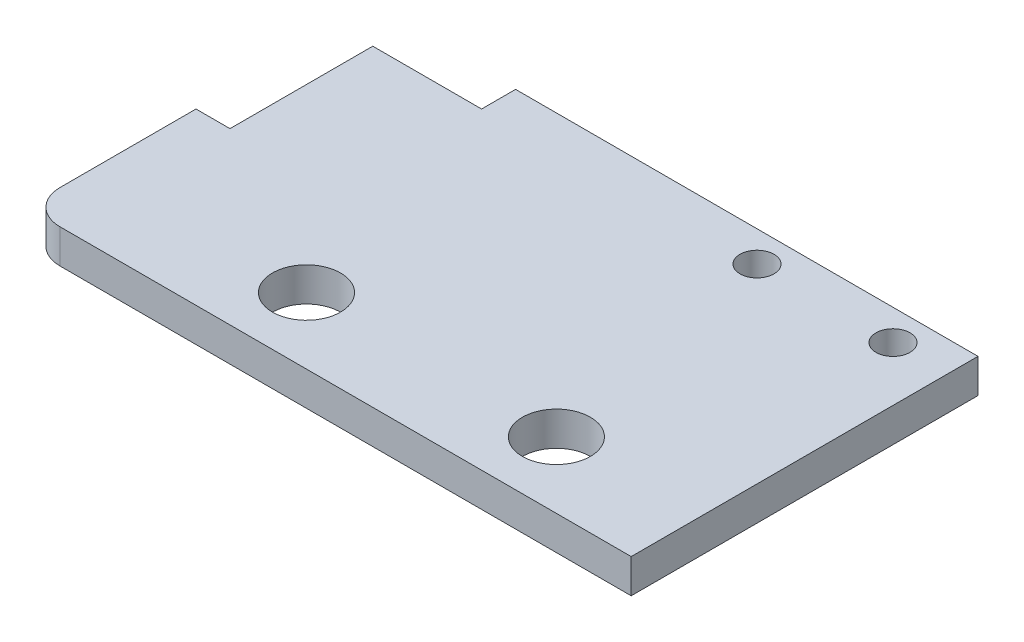
ISO-10303-21;
HEADER;
FILE_DESCRIPTION(('STEP AP214'),'2;1');
FILE_NAME('part.step','',(''),(''),'','','');
FILE_SCHEMA(('AUTOMOTIVE_DESIGN { 1 0 10303 214 1 1 1 1 }'));
ENDSEC;
DATA;
#1=APPLICATION_CONTEXT('core data for automotive mechanical design processes');
#2=APPLICATION_PROTOCOL_DEFINITION('international standard','automotive_design',2000,#1);
#3=PRODUCT_CONTEXT('',#1,'mechanical');
#4=PRODUCT('Part','Part','',(#3));
#5=PRODUCT_RELATED_PRODUCT_CATEGORY('part','',(#4));
#6=PRODUCT_DEFINITION_FORMATION('','',#4);
#7=PRODUCT_DEFINITION_CONTEXT('part definition',#1,'design');
#8=PRODUCT_DEFINITION('design','',#6,#7);
#9=PRODUCT_DEFINITION_SHAPE('','',#8);
#10=(LENGTH_UNIT() NAMED_UNIT(*) SI_UNIT(.MILLI.,.METRE.));
#11=(NAMED_UNIT(*) PLANE_ANGLE_UNIT() SI_UNIT($,.RADIAN.));
#12=(NAMED_UNIT(*) SI_UNIT($,.STERADIAN.) SOLID_ANGLE_UNIT());
#13=UNCERTAINTY_MEASURE_WITH_UNIT(LENGTH_MEASURE(1.E-05),#10,'distance_accuracy_value','');
#14=(GEOMETRIC_REPRESENTATION_CONTEXT(3) GLOBAL_UNCERTAINTY_ASSIGNED_CONTEXT((#13)) GLOBAL_UNIT_ASSIGNED_CONTEXT((#10,
#11,#12)) REPRESENTATION_CONTEXT('',''));
#15=CARTESIAN_POINT('',(0.,0.,0.));
#16=DIRECTION('',(0.,0.,1.));
#17=DIRECTION('',(1.,0.,0.));
#18=AXIS2_PLACEMENT_3D('',#15,#16,#17);
#19=CARTESIAN_POINT('',(3.2,1.,-9.2));
#20=DIRECTION('',(0.,0.,1.));
#21=DIRECTION('',(1.,0.,0.));
#22=AXIS2_PLACEMENT_3D('',#19,#20,#21);
#23=PLANE('',#22);
#24=DIRECTION('',(-1.,0.,0.));
#25=VECTOR('',#24,1.);
#26=CARTESIAN_POINT('',(3.2,0.,-9.2));
#27=LINE('',#26,#25);
#28=CARTESIAN_POINT('',(4.2,0.,-9.2));
#29=VERTEX_POINT('',#28);
#30=CARTESIAN_POINT('',(1.,0.,-9.2));
#31=VERTEX_POINT('',#30);
#32=EDGE_CURVE('E47',#29,#31,#27,.T.);
#33=ORIENTED_EDGE('',*,*,#32,.T.);
#34=DIRECTION('',(0.,-1.,0.));
#35=VECTOR('',#34,1.);
#36=CARTESIAN_POINT('',(1.,1.,-9.2));
#37=LINE('',#36,#35);
#38=CARTESIAN_POINT('',(1.,1.,-9.2));
#39=VERTEX_POINT('',#38);
#40=EDGE_CURVE('E108',#39,#31,#37,.T.);
#41=ORIENTED_EDGE('',*,*,#40,.F.);
#42=DIRECTION('',(-1.,0.,0.));
#43=VECTOR('',#42,1.);
#44=CARTESIAN_POINT('',(3.2,1.,-9.2));
#45=LINE('',#44,#43);
#46=CARTESIAN_POINT('',(4.2,1.,-9.2));
#47=VERTEX_POINT('',#46);
#48=EDGE_CURVE('E105',#47,#39,#45,.T.);
#49=ORIENTED_EDGE('',*,*,#48,.F.);
#50=DIRECTION('',(0.,1.,0.));
#51=VECTOR('',#50,1.);
#52=CARTESIAN_POINT('',(4.2,-9.,-9.2));
#53=LINE('',#52,#51);
#54=EDGE_CURVE('E107',#29,#47,#53,.T.);
#55=ORIENTED_EDGE('',*,*,#54,.F.);
#56=EDGE_LOOP('',(#33,#41,#49,#55));
#57=FACE_BOUND('',#56,.T.);
#58=ADVANCED_FACE('F32',(#57),#23,.F.);
#59=CARTESIAN_POINT('',(1.,1.,-5.));
#60=DIRECTION('',(-1.,0.,0.));
#61=DIRECTION('',(0.,0.,1.));
#62=AXIS2_PLACEMENT_3D('',#59,#60,#61);
#63=PLANE('',#62);
#64=DIRECTION('',(0.,0.,-1.));
#65=VECTOR('',#64,1.);
#66=CARTESIAN_POINT('',(1.,0.,-5.));
#67=LINE('',#66,#65);
#68=CARTESIAN_POINT('',(1.,0.,-5.));
#69=VERTEX_POINT('',#68);
#70=EDGE_CURVE('E166',#69,#31,#67,.T.);
#71=ORIENTED_EDGE('',*,*,#70,.F.);
#72=DIRECTION('',(0.,-1.,0.));
#73=VECTOR('',#72,1.);
#74=CARTESIAN_POINT('',(1.,1.,-5.));
#75=LINE('',#74,#73);
#76=CARTESIAN_POINT('',(1.,1.,-5.));
#77=VERTEX_POINT('',#76);
#78=EDGE_CURVE('E187',#77,#69,#75,.T.);
#79=ORIENTED_EDGE('',*,*,#78,.F.);
#80=DIRECTION('',(0.,0.,-1.));
#81=VECTOR('',#80,1.);
#82=CARTESIAN_POINT('',(1.,1.,-5.));
#83=LINE('',#82,#81);
#84=EDGE_CURVE('E113',#77,#39,#83,.T.);
#85=ORIENTED_EDGE('',*,*,#84,.T.);
#86=ORIENTED_EDGE('',*,*,#40,.T.);
#87=EDGE_LOOP('',(#71,#79,#85,#86));
#88=FACE_BOUND('',#87,.T.);
#89=ADVANCED_FACE('F215',(#88),#63,.T.);
#90=CARTESIAN_POINT('',(0.,1.,-5.));
#91=DIRECTION('',(0.,0.,-1.));
#92=DIRECTION('',(-1.,0.,0.));
#93=AXIS2_PLACEMENT_3D('',#90,#91,#92);
#94=PLANE('',#93);
#95=DIRECTION('',(1.,0.,0.));
#96=VECTOR('',#95,1.);
#97=CARTESIAN_POINT('',(0.,0.,-5.));
#98=LINE('',#97,#96);
#99=CARTESIAN_POINT('',(0.,0.,-5.));
#100=VERTEX_POINT('',#99);
#101=EDGE_CURVE('E168',#100,#69,#98,.T.);
#102=ORIENTED_EDGE('',*,*,#101,.F.);
#103=DIRECTION('',(0.,-1.,0.));
#104=VECTOR('',#103,1.);
#105=CARTESIAN_POINT('',(0.,1.,-5.));
#106=LINE('',#105,#104);
#107=CARTESIAN_POINT('',(0.,1.,-5.));
#108=VERTEX_POINT('',#107);
#109=EDGE_CURVE('E184',#108,#100,#106,.T.);
#110=ORIENTED_EDGE('',*,*,#109,.F.);
#111=DIRECTION('',(1.,0.,0.));
#112=VECTOR('',#111,1.);
#113=CARTESIAN_POINT('',(0.,1.,-5.));
#114=LINE('',#113,#112);
#115=EDGE_CURVE('E154',#108,#77,#114,.T.);
#116=ORIENTED_EDGE('',*,*,#115,.T.);
#117=ORIENTED_EDGE('',*,*,#78,.T.);
#118=EDGE_LOOP('',(#102,#110,#116,#117));
#119=FACE_BOUND('',#118,.T.);
#120=ADVANCED_FACE('F212',(#119),#94,.T.);
#121=CARTESIAN_POINT('',(0.,1.,0.));
#122=DIRECTION('',(-1.,0.,0.));
#123=DIRECTION('',(0.,0.,1.));
#124=AXIS2_PLACEMENT_3D('',#121,#122,#123);
#125=PLANE('',#124);
#126=DIRECTION('',(0.,0.,-1.));
#127=VECTOR('',#126,1.);
#128=CARTESIAN_POINT('',(0.,0.,0.));
#129=LINE('',#128,#127);
#130=CARTESIAN_POINT('',(0.,0.,-1.));
#131=VERTEX_POINT('',#130);
#132=EDGE_CURVE('E171',#131,#100,#129,.T.);
#133=ORIENTED_EDGE('',*,*,#132,.F.);
#134=DIRECTION('',(0.,-1.,0.));
#135=VECTOR('',#134,1.);
#136=CARTESIAN_POINT('',(0.,1.,-1.));
#137=LINE('',#136,#135);
#138=CARTESIAN_POINT('',(0.,1.,-1.));
#139=VERTEX_POINT('',#138);
#140=EDGE_CURVE('E55',#131,#139,#137,.F.);
#141=ORIENTED_EDGE('',*,*,#140,.T.);
#142=DIRECTION('',(0.,0.,-1.));
#143=VECTOR('',#142,1.);
#144=CARTESIAN_POINT('',(0.,1.,0.));
#145=LINE('',#144,#143);
#146=EDGE_CURVE('E157',#139,#108,#145,.T.);
#147=ORIENTED_EDGE('',*,*,#146,.T.);
#148=ORIENTED_EDGE('',*,*,#109,.T.);
#149=EDGE_LOOP('',(#133,#141,#147,#148));
#150=FACE_BOUND('',#149,.T.);
#151=ADVANCED_FACE('F208',(#150),#125,.T.);
#152=CARTESIAN_POINT('',(0.,1.,0.));
#153=DIRECTION('',(0.,0.,-1.));
#154=DIRECTION('',(-1.,0.,0.));
#155=AXIS2_PLACEMENT_3D('',#152,#153,#154);
#156=PLANE('',#155);
#157=DIRECTION('',(1.,0.,0.));
#158=VECTOR('',#157,1.);
#159=CARTESIAN_POINT('',(0.,1.,0.));
#160=LINE('',#159,#158);
#161=CARTESIAN_POINT('',(1.,1.,0.));
#162=VERTEX_POINT('',#161);
#163=CARTESIAN_POINT('',(17.8,1.,0.));
#164=VERTEX_POINT('',#163);
#165=EDGE_CURVE('E159',#162,#164,#160,.T.);
#166=ORIENTED_EDGE('',*,*,#165,.F.);
#167=DIRECTION('',(0.,-1.,0.));
#168=VECTOR('',#167,1.);
#169=CARTESIAN_POINT('',(1.,0.,0.));
#170=LINE('',#169,#168);
#171=CARTESIAN_POINT('',(1.,0.,0.));
#172=VERTEX_POINT('',#171);
#173=EDGE_CURVE('E190',#162,#172,#170,.T.);
#174=ORIENTED_EDGE('',*,*,#173,.T.);
#175=DIRECTION('',(1.,0.,0.));
#176=VECTOR('',#175,1.);
#177=CARTESIAN_POINT('',(0.,0.,0.));
#178=LINE('',#177,#176);
#179=CARTESIAN_POINT('',(17.8,0.,0.));
#180=VERTEX_POINT('',#179);
#181=EDGE_CURVE('E173',#172,#180,#178,.T.);
#182=ORIENTED_EDGE('',*,*,#181,.T.);
#183=DIRECTION('',(0.,-1.,0.));
#184=VECTOR('',#183,1.);
#185=CARTESIAN_POINT('',(17.8,1.,0.));
#186=LINE('',#185,#184);
#187=EDGE_CURVE('E181',#164,#180,#186,.T.);
#188=ORIENTED_EDGE('',*,*,#187,.F.);
#189=EDGE_LOOP('',(#166,#174,#182,#188));
#190=FACE_BOUND('',#189,.T.);
#191=ADVANCED_FACE('F202',(#190),#156,.F.);
#192=CARTESIAN_POINT('',(17.8,1.,0.));
#193=DIRECTION('',(-1.,0.,0.));
#194=DIRECTION('',(0.,0.,1.));
#195=AXIS2_PLACEMENT_3D('',#192,#193,#194);
#196=PLANE('',#195);
#197=DIRECTION('',(0.,0.,-1.));
#198=VECTOR('',#197,1.);
#199=CARTESIAN_POINT('',(17.8,0.,0.));
#200=LINE('',#199,#198);
#201=CARTESIAN_POINT('',(17.8,0.,-10.2));
#202=VERTEX_POINT('',#201);
#203=EDGE_CURVE('E175',#180,#202,#200,.T.);
#204=ORIENTED_EDGE('',*,*,#203,.T.);
#205=DIRECTION('',(0.,-1.,0.));
#206=VECTOR('',#205,1.);
#207=CARTESIAN_POINT('',(17.8,1.,-10.2));
#208=LINE('',#207,#206);
#209=CARTESIAN_POINT('',(17.8,1.,-10.2));
#210=VERTEX_POINT('',#209);
#211=EDGE_CURVE('E164',#210,#202,#208,.T.);
#212=ORIENTED_EDGE('',*,*,#211,.F.);
#213=DIRECTION('',(0.,0.,-1.));
#214=VECTOR('',#213,1.);
#215=CARTESIAN_POINT('',(17.8,1.,0.));
#216=LINE('',#215,#214);
#217=EDGE_CURVE('E161',#164,#210,#216,.T.);
#218=ORIENTED_EDGE('',*,*,#217,.F.);
#219=ORIENTED_EDGE('',*,*,#187,.T.);
#220=EDGE_LOOP('',(#204,#212,#218,#219));
#221=FACE_BOUND('',#220,.T.);
#222=ADVANCED_FACE('F228',(#221),#196,.F.);
#223=CARTESIAN_POINT('',(3.2,1.,-10.2));
#224=DIRECTION('',(0.,0.,-1.));
#225=DIRECTION('',(-1.,0.,0.));
#226=AXIS2_PLACEMENT_3D('',#223,#224,#225);
#227=PLANE('',#226);
#228=DIRECTION('',(0.,1.,0.));
#229=VECTOR('',#228,1.);
#230=CARTESIAN_POINT('',(4.2,-9.,-10.2));
#231=LINE('',#230,#229);
#232=CARTESIAN_POINT('',(4.2,0.,-10.2));
#233=VERTEX_POINT('',#232);
#234=CARTESIAN_POINT('',(4.2,1.,-10.2));
#235=VERTEX_POINT('',#234);
#236=EDGE_CURVE('E120',#233,#235,#231,.T.);
#237=ORIENTED_EDGE('',*,*,#236,.T.);
#238=DIRECTION('',(1.,0.,0.));
#239=VECTOR('',#238,1.);
#240=CARTESIAN_POINT('',(3.2,1.,-10.2));
#241=LINE('',#240,#239);
#242=EDGE_CURVE('E125',#235,#210,#241,.T.);
#243=ORIENTED_EDGE('',*,*,#242,.T.);
#244=ORIENTED_EDGE('',*,*,#211,.T.);
#245=DIRECTION('',(1.,0.,0.));
#246=VECTOR('',#245,1.);
#247=CARTESIAN_POINT('',(3.2,0.,-10.2));
#248=LINE('',#247,#246);
#249=EDGE_CURVE('E114',#233,#202,#248,.T.);
#250=ORIENTED_EDGE('',*,*,#249,.F.);
#251=EDGE_LOOP('',(#237,#243,#244,#250));
#252=FACE_BOUND('',#251,.T.);
#253=ADVANCED_FACE('F231',(#252),#227,.T.);
#254=CARTESIAN_POINT('',(0.,1.,0.));
#255=DIRECTION('',(0.,-1.,0.));
#256=DIRECTION('',(0.,0.,-1.));
#257=AXIS2_PLACEMENT_3D('',#254,#255,#256);
#258=PLANE('',#257);
#259=CARTESIAN_POINT('',(16.2,1.,-9.3));
#260=DIRECTION('',(0.,1.,0.));
#261=DIRECTION('',(0.,0.,1.));
#262=AXIS2_PLACEMENT_3D('',#259,#260,#261);
#263=CIRCLE('',#262,0.499999999999999);
#264=CARTESIAN_POINT('',(16.2,1.,-8.8));
#265=VERTEX_POINT('',#264);
#266=EDGE_CURVE('E140',#265,#265,#263,.T.);
#267=ORIENTED_EDGE('',*,*,#266,.F.);
#268=EDGE_LOOP('',(#267));
#269=FACE_BOUND('',#268,.T.);
#270=CARTESIAN_POINT('',(6.3,1.,-1.95));
#271=DIRECTION('',(0.,1.,0.));
#272=DIRECTION('',(0.,0.,1.));
#273=AXIS2_PLACEMENT_3D('',#270,#271,#272);
#274=CIRCLE('',#273,1.);
#275=CARTESIAN_POINT('',(6.3,1.,-0.95));
#276=VERTEX_POINT('',#275);
#277=EDGE_CURVE('E133',#276,#276,#274,.T.);
#278=ORIENTED_EDGE('',*,*,#277,.F.);
#279=EDGE_LOOP('',(#278));
#280=FACE_BOUND('',#279,.T.);
#281=CARTESIAN_POINT('',(13.65,1.,-1.95));
#282=DIRECTION('',(0.,1.,0.));
#283=DIRECTION('',(0.,0.,1.));
#284=AXIS2_PLACEMENT_3D('',#281,#282,#283);
#285=CIRCLE('',#284,1.);
#286=CARTESIAN_POINT('',(13.65,1.,-0.95));
#287=VERTEX_POINT('',#286);
#288=EDGE_CURVE('E128',#287,#287,#285,.T.);
#289=ORIENTED_EDGE('',*,*,#288,.F.);
#290=EDGE_LOOP('',(#289));
#291=FACE_BOUND('',#290,.T.);
#292=CARTESIAN_POINT('',(12.2,1.,-9.3));
#293=DIRECTION('',(0.,1.,0.));
#294=DIRECTION('',(0.,0.,1.));
#295=AXIS2_PLACEMENT_3D('',#292,#293,#294);
#296=CIRCLE('',#295,0.500000000000001);
#297=CARTESIAN_POINT('',(12.2,1.,-8.8));
#298=VERTEX_POINT('',#297);
#299=EDGE_CURVE('E139',#298,#298,#296,.T.);
#300=ORIENTED_EDGE('',*,*,#299,.F.);
#301=EDGE_LOOP('',(#300));
#302=FACE_BOUND('',#301,.T.);
#303=ORIENTED_EDGE('',*,*,#242,.F.);
#304=DIRECTION('',(0.,0.,-1.));
#305=VECTOR('',#304,1.);
#306=CARTESIAN_POINT('',(4.2,1.,-9.2));
#307=LINE('',#306,#305);
#308=EDGE_CURVE('E118',#47,#235,#307,.T.);
#309=ORIENTED_EDGE('',*,*,#308,.F.);
#310=ORIENTED_EDGE('',*,*,#48,.T.);
#311=ORIENTED_EDGE('',*,*,#84,.F.);
#312=ORIENTED_EDGE('',*,*,#115,.F.);
#313=ORIENTED_EDGE('',*,*,#146,.F.);
#314=CARTESIAN_POINT('',(1.,1.,-1.));
#315=DIRECTION('',(0.,-1.,0.));
#316=DIRECTION('',(0.,0.,-1.));
#317=AXIS2_PLACEMENT_3D('',#314,#315,#316);
#318=CIRCLE('',#317,1.);
#319=EDGE_CURVE('E40',#139,#162,#318,.F.);
#320=ORIENTED_EDGE('',*,*,#319,.T.);
#321=ORIENTED_EDGE('',*,*,#165,.T.);
#322=ORIENTED_EDGE('',*,*,#217,.T.);
#323=EDGE_LOOP('',(#303,#309,#310,#311,#312,#313,#320,#321,#322));
#324=FACE_BOUND('',#323,.T.);
#325=ADVANCED_FACE('F123',(#269,#280,#291,#302,#324),#258,.F.);
#326=CARTESIAN_POINT('',(0.,0.,0.));
#327=DIRECTION('',(0.,-1.,0.));
#328=DIRECTION('',(0.,0.,-1.));
#329=AXIS2_PLACEMENT_3D('',#326,#327,#328);
#330=PLANE('',#329);
#331=DIRECTION('',(0.,0.,1.));
#332=VECTOR('',#331,1.);
#333=CARTESIAN_POINT('',(4.2,0.,0.));
#334=LINE('',#333,#332);
#335=EDGE_CURVE('E11',#233,#29,#334,.T.);
#336=ORIENTED_EDGE('',*,*,#335,.F.);
#337=ORIENTED_EDGE('',*,*,#249,.T.);
#338=ORIENTED_EDGE('',*,*,#203,.F.);
#339=ORIENTED_EDGE('',*,*,#181,.F.);
#340=CARTESIAN_POINT('',(1.,0.,-1.));
#341=DIRECTION('',(0.,-1.,0.));
#342=DIRECTION('',(0.,0.,-1.));
#343=AXIS2_PLACEMENT_3D('',#340,#341,#342);
#344=CIRCLE('',#343,1.);
#345=EDGE_CURVE('E193',#172,#131,#344,.T.);
#346=ORIENTED_EDGE('',*,*,#345,.T.);
#347=ORIENTED_EDGE('',*,*,#132,.T.);
#348=ORIENTED_EDGE('',*,*,#101,.T.);
#349=ORIENTED_EDGE('',*,*,#70,.T.);
#350=ORIENTED_EDGE('',*,*,#32,.F.);
#351=EDGE_LOOP('',(#336,#337,#338,#339,#346,#347,#348,#349,#350));
#352=FACE_BOUND('',#351,.T.);
#353=CARTESIAN_POINT('',(16.2,0.,-9.3));
#354=DIRECTION('',(0.,1.,0.));
#355=DIRECTION('',(0.,0.,1.));
#356=AXIS2_PLACEMENT_3D('',#353,#354,#355);
#357=CIRCLE('',#356,0.499999999999999);
#358=CARTESIAN_POINT('',(16.2,0.,-8.8));
#359=VERTEX_POINT('',#358);
#360=EDGE_CURVE('E136',#359,#359,#357,.T.);
#361=ORIENTED_EDGE('',*,*,#360,.T.);
#362=EDGE_LOOP('',(#361));
#363=FACE_BOUND('',#362,.T.);
#364=CARTESIAN_POINT('',(6.3,0.,-1.95));
#365=DIRECTION('',(0.,1.,0.));
#366=DIRECTION('',(0.,0.,1.));
#367=AXIS2_PLACEMENT_3D('',#364,#365,#366);
#368=CIRCLE('',#367,1.);
#369=CARTESIAN_POINT('',(6.3,0.,-0.95));
#370=VERTEX_POINT('',#369);
#371=EDGE_CURVE('E143',#370,#370,#368,.T.);
#372=ORIENTED_EDGE('',*,*,#371,.T.);
#373=EDGE_LOOP('',(#372));
#374=FACE_BOUND('',#373,.T.);
#375=CARTESIAN_POINT('',(13.65,0.,-1.95));
#376=DIRECTION('',(0.,1.,0.));
#377=DIRECTION('',(0.,0.,1.));
#378=AXIS2_PLACEMENT_3D('',#375,#376,#377);
#379=CIRCLE('',#378,1.);
#380=CARTESIAN_POINT('',(13.65,0.,-0.95));
#381=VERTEX_POINT('',#380);
#382=EDGE_CURVE('E130',#381,#381,#379,.T.);
#383=ORIENTED_EDGE('',*,*,#382,.T.);
#384=EDGE_LOOP('',(#383));
#385=FACE_BOUND('',#384,.T.);
#386=CARTESIAN_POINT('',(12.2,0.,-9.3));
#387=DIRECTION('',(0.,1.,0.));
#388=DIRECTION('',(0.,0.,1.));
#389=AXIS2_PLACEMENT_3D('',#386,#387,#388);
#390=CIRCLE('',#389,0.500000000000001);
#391=CARTESIAN_POINT('',(12.2,0.,-8.8));
#392=VERTEX_POINT('',#391);
#393=EDGE_CURVE('E148',#392,#392,#390,.T.);
#394=ORIENTED_EDGE('',*,*,#393,.T.);
#395=EDGE_LOOP('',(#394));
#396=FACE_BOUND('',#395,.T.);
#397=ADVANCED_FACE('F205',(#352,#363,#374,#385,#396),#330,.T.);
#398=CARTESIAN_POINT('',(12.2,0.,-9.3));
#399=DIRECTION('',(0.,1.,0.));
#400=DIRECTION('',(0.,0.,1.));
#401=AXIS2_PLACEMENT_3D('',#398,#399,#400);
#402=CYLINDRICAL_SURFACE('',#401,0.500000000000001);
#403=ORIENTED_EDGE('',*,*,#393,.F.);
#404=EDGE_LOOP('',(#403));
#405=FACE_BOUND('',#404,.T.);
#406=ORIENTED_EDGE('',*,*,#299,.T.);
#407=EDGE_LOOP('',(#406));
#408=FACE_BOUND('',#407,.T.);
#409=ADVANCED_FACE('F238',(#405,#408),#402,.F.);
#410=CARTESIAN_POINT('',(13.65,0.,-1.95));
#411=DIRECTION('',(0.,1.,0.));
#412=DIRECTION('',(0.,0.,1.));
#413=AXIS2_PLACEMENT_3D('',#410,#411,#412);
#414=CYLINDRICAL_SURFACE('',#413,1.);
#415=ORIENTED_EDGE('',*,*,#382,.F.);
#416=EDGE_LOOP('',(#415));
#417=FACE_BOUND('',#416,.T.);
#418=ORIENTED_EDGE('',*,*,#288,.T.);
#419=EDGE_LOOP('',(#418));
#420=FACE_BOUND('',#419,.T.);
#421=ADVANCED_FACE('F244',(#417,#420),#414,.F.);
#422=CARTESIAN_POINT('',(6.3,0.,-1.95));
#423=DIRECTION('',(0.,1.,0.));
#424=DIRECTION('',(0.,0.,1.));
#425=AXIS2_PLACEMENT_3D('',#422,#423,#424);
#426=CYLINDRICAL_SURFACE('',#425,1.);
#427=ORIENTED_EDGE('',*,*,#371,.F.);
#428=EDGE_LOOP('',(#427));
#429=FACE_BOUND('',#428,.T.);
#430=ORIENTED_EDGE('',*,*,#277,.T.);
#431=EDGE_LOOP('',(#430));
#432=FACE_BOUND('',#431,.T.);
#433=ADVANCED_FACE('F246',(#429,#432),#426,.F.);
#434=CARTESIAN_POINT('',(16.2,0.,-9.3));
#435=DIRECTION('',(0.,1.,0.));
#436=DIRECTION('',(0.,0.,1.));
#437=AXIS2_PLACEMENT_3D('',#434,#435,#436);
#438=CYLINDRICAL_SURFACE('',#437,0.499999999999999);
#439=ORIENTED_EDGE('',*,*,#360,.F.);
#440=EDGE_LOOP('',(#439));
#441=FACE_BOUND('',#440,.T.);
#442=ORIENTED_EDGE('',*,*,#266,.T.);
#443=EDGE_LOOP('',(#442));
#444=FACE_BOUND('',#443,.T.);
#445=ADVANCED_FACE('F249',(#441,#444),#438,.F.);
#446=CARTESIAN_POINT('',(1.,1.,-1.));
#447=DIRECTION('',(0.,1.,0.));
#448=DIRECTION('',(0.,0.,1.));
#449=AXIS2_PLACEMENT_3D('',#446,#447,#448);
#450=CYLINDRICAL_SURFACE('',#449,1.);
#451=ORIENTED_EDGE('',*,*,#319,.F.);
#452=ORIENTED_EDGE('',*,*,#140,.F.);
#453=ORIENTED_EDGE('',*,*,#345,.F.);
#454=ORIENTED_EDGE('',*,*,#173,.F.);
#455=EDGE_LOOP('',(#451,#452,#453,#454));
#456=FACE_BOUND('',#455,.T.);
#457=ADVANCED_FACE('F34',(#456),#450,.T.);
#458=CARTESIAN_POINT('',(4.2,-9.,-9.2));
#459=DIRECTION('',(1.,0.,0.));
#460=DIRECTION('',(0.,0.,-1.));
#461=AXIS2_PLACEMENT_3D('',#458,#459,#460);
#462=PLANE('',#461);
#463=ORIENTED_EDGE('',*,*,#335,.T.);
#464=ORIENTED_EDGE('',*,*,#54,.T.);
#465=ORIENTED_EDGE('',*,*,#308,.T.);
#466=ORIENTED_EDGE('',*,*,#236,.F.);
#467=EDGE_LOOP('',(#463,#464,#465,#466));
#468=FACE_BOUND('',#467,.T.);
#469=ADVANCED_FACE('F117',(#468),#462,.F.);
#470=CLOSED_SHELL('',(#58,#89,#120,#151,#191,#222,#253,#325,#397,#409,#421,#433,#445,#457,#469));
#471=MANIFOLD_SOLID_BREP('B2',#470);
#472=ADVANCED_BREP_SHAPE_REPRESENTATION('',(#18,#471),#14);
#473=SHAPE_DEFINITION_REPRESENTATION(#9,#472);
ENDSEC;
END-ISO-10303-21;
